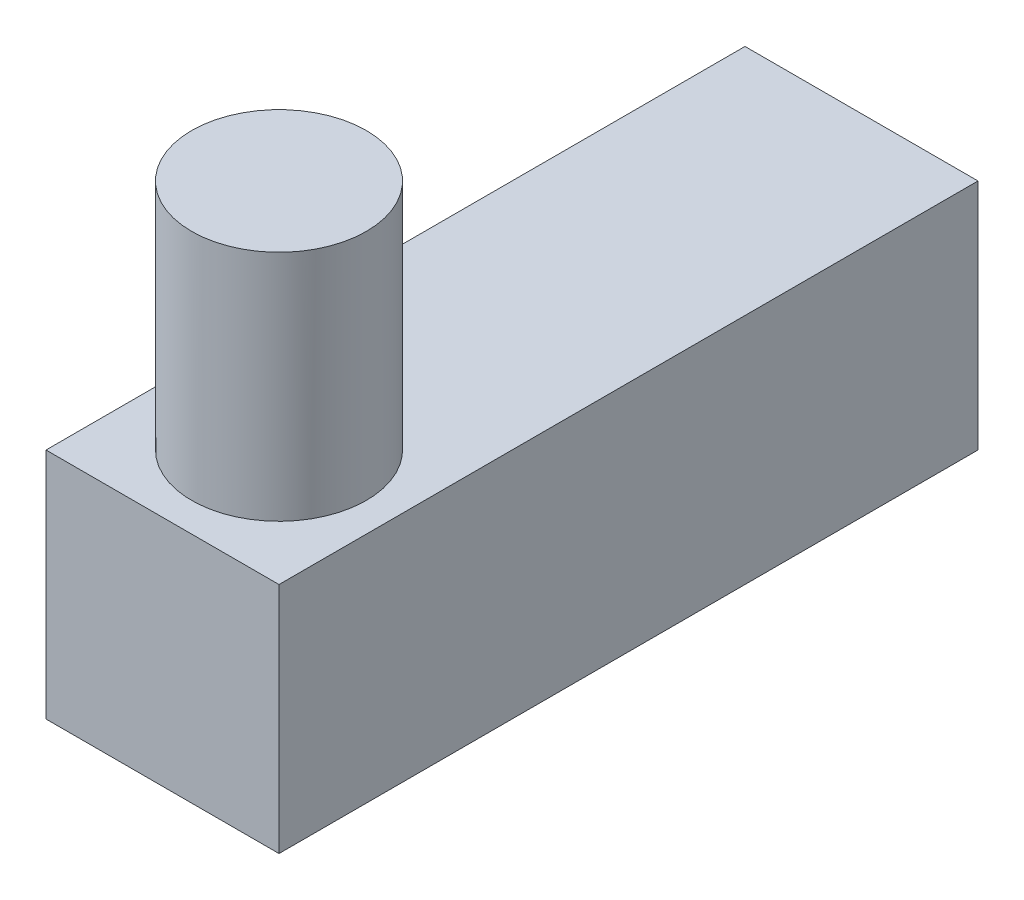
ISO-10303-21;
HEADER;
FILE_DESCRIPTION(('STEP AP214'),'2;1');
FILE_NAME('part.step','',(''),(''),'','','');
FILE_SCHEMA(('AUTOMOTIVE_DESIGN { 1 0 10303 214 1 1 1 1 }'));
ENDSEC;
DATA;
#1=APPLICATION_CONTEXT('core data for automotive mechanical design processes');
#2=APPLICATION_PROTOCOL_DEFINITION('international standard','automotive_design',2000,#1);
#3=PRODUCT_CONTEXT('',#1,'mechanical');
#4=PRODUCT('Part','Part','',(#3));
#5=PRODUCT_RELATED_PRODUCT_CATEGORY('part','',(#4));
#6=PRODUCT_DEFINITION_FORMATION('','',#4);
#7=PRODUCT_DEFINITION_CONTEXT('part definition',#1,'design');
#8=PRODUCT_DEFINITION('design','',#6,#7);
#9=PRODUCT_DEFINITION_SHAPE('','',#8);
#10=(LENGTH_UNIT() NAMED_UNIT(*) SI_UNIT(.MILLI.,.METRE.));
#11=(NAMED_UNIT(*) PLANE_ANGLE_UNIT() SI_UNIT($,.RADIAN.));
#12=(NAMED_UNIT(*) SI_UNIT($,.STERADIAN.) SOLID_ANGLE_UNIT());
#13=UNCERTAINTY_MEASURE_WITH_UNIT(LENGTH_MEASURE(1.E-05),#10,'distance_accuracy_value','');
#14=(GEOMETRIC_REPRESENTATION_CONTEXT(3) GLOBAL_UNCERTAINTY_ASSIGNED_CONTEXT((#13)) GLOBAL_UNIT_ASSIGNED_CONTEXT((#10,
#11,#12)) REPRESENTATION_CONTEXT('',''));
#15=CARTESIAN_POINT('',(0.,0.,0.));
#16=DIRECTION('',(0.,0.,1.));
#17=DIRECTION('',(1.,0.,0.));
#18=AXIS2_PLACEMENT_3D('',#15,#16,#17);
#19=CARTESIAN_POINT('',(0.,101.6,0.));
#20=DIRECTION('',(1.,0.,0.));
#21=DIRECTION('',(0.,0.,-1.));
#22=AXIS2_PLACEMENT_3D('',#19,#20,#21);
#23=PLANE('',#22);
#24=DIRECTION('',(0.,0.,1.));
#25=VECTOR('',#24,1.);
#26=CARTESIAN_POINT('',(0.,0.,0.));
#27=LINE('',#26,#25);
#28=CARTESIAN_POINT('',(0.,0.,-304.8));
#29=VERTEX_POINT('',#28);
#30=CARTESIAN_POINT('',(0.,0.,0.));
#31=VERTEX_POINT('',#30);
#32=EDGE_CURVE('E99',#29,#31,#27,.T.);
#33=ORIENTED_EDGE('',*,*,#32,.T.);
#34=DIRECTION('',(0.,-1.,0.));
#35=VECTOR('',#34,1.);
#36=CARTESIAN_POINT('',(0.,101.6,0.));
#37=LINE('',#36,#35);
#38=CARTESIAN_POINT('',(0.,101.6,0.));
#39=VERTEX_POINT('',#38);
#40=EDGE_CURVE('E41',#39,#31,#37,.T.);
#41=ORIENTED_EDGE('',*,*,#40,.F.);
#42=DIRECTION('',(0.,0.,1.));
#43=VECTOR('',#42,1.);
#44=CARTESIAN_POINT('',(0.,101.6,0.));
#45=LINE('',#44,#43);
#46=CARTESIAN_POINT('',(0.,101.6,-304.8));
#47=VERTEX_POINT('',#46);
#48=EDGE_CURVE('E85',#47,#39,#45,.T.);
#49=ORIENTED_EDGE('',*,*,#48,.F.);
#50=DIRECTION('',(0.,-1.,0.));
#51=VECTOR('',#50,1.);
#52=CARTESIAN_POINT('',(0.,101.6,-304.8));
#53=LINE('',#52,#51);
#54=EDGE_CURVE('E95',#47,#29,#53,.T.);
#55=ORIENTED_EDGE('',*,*,#54,.T.);
#56=EDGE_LOOP('',(#33,#41,#49,#55));
#57=FACE_BOUND('',#56,.T.);
#58=ADVANCED_FACE('F33',(#57),#23,.F.);
#59=CARTESIAN_POINT('',(0.,101.6,0.));
#60=DIRECTION('',(0.,0.,-1.));
#61=DIRECTION('',(-1.,0.,0.));
#62=AXIS2_PLACEMENT_3D('',#59,#60,#61);
#63=PLANE('',#62);
#64=DIRECTION('',(1.,0.,0.));
#65=VECTOR('',#64,1.);
#66=CARTESIAN_POINT('',(0.,0.,0.));
#67=LINE('',#66,#65);
#68=CARTESIAN_POINT('',(101.6,0.,0.));
#69=VERTEX_POINT('',#68);
#70=EDGE_CURVE('E90',#31,#69,#67,.T.);
#71=ORIENTED_EDGE('',*,*,#70,.T.);
#72=DIRECTION('',(0.,-1.,0.));
#73=VECTOR('',#72,1.);
#74=CARTESIAN_POINT('',(101.6,101.6,0.));
#75=LINE('',#74,#73);
#76=CARTESIAN_POINT('',(101.6,101.6,0.));
#77=VERTEX_POINT('',#76);
#78=EDGE_CURVE('E88',#77,#69,#75,.T.);
#79=ORIENTED_EDGE('',*,*,#78,.F.);
#80=DIRECTION('',(1.,0.,0.));
#81=VECTOR('',#80,1.);
#82=CARTESIAN_POINT('',(0.,101.6,0.));
#83=LINE('',#82,#81);
#84=EDGE_CURVE('E80',#39,#77,#83,.T.);
#85=ORIENTED_EDGE('',*,*,#84,.F.);
#86=ORIENTED_EDGE('',*,*,#40,.T.);
#87=EDGE_LOOP('',(#71,#79,#85,#86));
#88=FACE_BOUND('',#87,.T.);
#89=ADVANCED_FACE('F89',(#88),#63,.F.);
#90=CARTESIAN_POINT('',(101.6,101.6,0.));
#91=DIRECTION('',(-1.,0.,0.));
#92=DIRECTION('',(0.,0.,1.));
#93=AXIS2_PLACEMENT_3D('',#90,#91,#92);
#94=PLANE('',#93);
#95=DIRECTION('',(0.,0.,-1.));
#96=VECTOR('',#95,1.);
#97=CARTESIAN_POINT('',(101.6,0.,0.));
#98=LINE('',#97,#96);
#99=CARTESIAN_POINT('',(101.6,0.,-304.8));
#100=VERTEX_POINT('',#99);
#101=EDGE_CURVE('E66',#69,#100,#98,.T.);
#102=ORIENTED_EDGE('',*,*,#101,.T.);
#103=DIRECTION('',(0.,-1.,0.));
#104=VECTOR('',#103,1.);
#105=CARTESIAN_POINT('',(101.6,101.6,-304.8));
#106=LINE('',#105,#104);
#107=CARTESIAN_POINT('',(101.6,101.6,-304.8));
#108=VERTEX_POINT('',#107);
#109=EDGE_CURVE('E91',#108,#100,#106,.T.);
#110=ORIENTED_EDGE('',*,*,#109,.F.);
#111=DIRECTION('',(0.,0.,-1.));
#112=VECTOR('',#111,1.);
#113=CARTESIAN_POINT('',(101.6,101.6,0.));
#114=LINE('',#113,#112);
#115=EDGE_CURVE('E83',#77,#108,#114,.T.);
#116=ORIENTED_EDGE('',*,*,#115,.F.);
#117=ORIENTED_EDGE('',*,*,#78,.T.);
#118=EDGE_LOOP('',(#102,#110,#116,#117));
#119=FACE_BOUND('',#118,.T.);
#120=ADVANCED_FACE('F93',(#119),#94,.F.);
#121=CARTESIAN_POINT('',(0.,101.6,-304.8));
#122=DIRECTION('',(0.,0.,1.));
#123=DIRECTION('',(1.,0.,0.));
#124=AXIS2_PLACEMENT_3D('',#121,#122,#123);
#125=PLANE('',#124);
#126=DIRECTION('',(-1.,0.,0.));
#127=VECTOR('',#126,1.);
#128=CARTESIAN_POINT('',(0.,0.,-304.8));
#129=LINE('',#128,#127);
#130=EDGE_CURVE('E72',#100,#29,#129,.T.);
#131=ORIENTED_EDGE('',*,*,#130,.T.);
#132=ORIENTED_EDGE('',*,*,#54,.F.);
#133=DIRECTION('',(-1.,0.,0.));
#134=VECTOR('',#133,1.);
#135=CARTESIAN_POINT('',(0.,101.6,-304.8));
#136=LINE('',#135,#134);
#137=EDGE_CURVE('E49',#108,#47,#136,.T.);
#138=ORIENTED_EDGE('',*,*,#137,.F.);
#139=ORIENTED_EDGE('',*,*,#109,.T.);
#140=EDGE_LOOP('',(#131,#132,#138,#139));
#141=FACE_BOUND('',#140,.T.);
#142=ADVANCED_FACE('F121',(#141),#125,.F.);
#143=CARTESIAN_POINT('',(0.,101.6,0.));
#144=DIRECTION('',(0.,-1.,0.));
#145=DIRECTION('',(0.,0.,-1.));
#146=AXIS2_PLACEMENT_3D('',#143,#144,#145);
#147=PLANE('',#146);
#148=CARTESIAN_POINT('',(50.8,101.6,-50.8));
#149=DIRECTION('',(0.,-1.,0.));
#150=DIRECTION('',(0.,0.,-1.));
#151=AXIS2_PLACEMENT_3D('',#148,#149,#150);
#152=CIRCLE('',#151,38.1);
#153=CARTESIAN_POINT('',(50.8,101.6,-88.9));
#154=VERTEX_POINT('',#153);
#155=EDGE_CURVE('E11',#154,#154,#152,.F.);
#156=ORIENTED_EDGE('',*,*,#155,.F.);
#157=EDGE_LOOP('',(#156));
#158=FACE_BOUND('',#157,.T.);
#159=ORIENTED_EDGE('',*,*,#48,.T.);
#160=ORIENTED_EDGE('',*,*,#84,.T.);
#161=ORIENTED_EDGE('',*,*,#115,.T.);
#162=ORIENTED_EDGE('',*,*,#137,.T.);
#163=EDGE_LOOP('',(#159,#160,#161,#162));
#164=FACE_BOUND('',#163,.T.);
#165=ADVANCED_FACE('F81',(#158,#164),#147,.F.);
#166=CARTESIAN_POINT('',(0.,0.,0.));
#167=DIRECTION('',(0.,-1.,0.));
#168=DIRECTION('',(0.,0.,-1.));
#169=AXIS2_PLACEMENT_3D('',#166,#167,#168);
#170=PLANE('',#169);
#171=ORIENTED_EDGE('',*,*,#32,.F.);
#172=ORIENTED_EDGE('',*,*,#130,.F.);
#173=ORIENTED_EDGE('',*,*,#101,.F.);
#174=ORIENTED_EDGE('',*,*,#70,.F.);
#175=EDGE_LOOP('',(#171,#172,#173,#174));
#176=FACE_BOUND('',#175,.T.);
#177=ADVANCED_FACE('F110',(#176),#170,.T.);
#178=CARTESIAN_POINT('',(50.8,203.2,-50.8));
#179=DIRECTION('',(0.,-1.,0.));
#180=DIRECTION('',(0.,0.,-1.));
#181=AXIS2_PLACEMENT_3D('',#178,#179,#180);
#182=CYLINDRICAL_SURFACE('',#181,38.1);
#183=CARTESIAN_POINT('',(50.8,203.2,-50.8));
#184=DIRECTION('',(0.,1.,0.));
#185=DIRECTION('',(0.,0.,1.));
#186=AXIS2_PLACEMENT_3D('',#183,#184,#185);
#187=CIRCLE('',#186,38.1);
#188=CARTESIAN_POINT('',(50.8,203.2,-12.7));
#189=VERTEX_POINT('',#188);
#190=EDGE_CURVE('E102',#189,#189,#187,.T.);
#191=ORIENTED_EDGE('',*,*,#190,.F.);
#192=EDGE_LOOP('',(#191));
#193=FACE_BOUND('',#192,.T.);
#194=ORIENTED_EDGE('',*,*,#155,.T.);
#195=EDGE_LOOP('',(#194));
#196=FACE_BOUND('',#195,.T.);
#197=ADVANCED_FACE('F112',(#193,#196),#182,.T.);
#198=CARTESIAN_POINT('',(50.8,203.2,-50.8));
#199=DIRECTION('',(0.,1.,0.));
#200=DIRECTION('',(0.,0.,1.));
#201=AXIS2_PLACEMENT_3D('',#198,#199,#200);
#202=PLANE('',#201);
#203=ORIENTED_EDGE('',*,*,#190,.T.);
#204=EDGE_LOOP('',(#203));
#205=FACE_BOUND('',#204,.T.);
#206=ADVANCED_FACE('F118',(#205),#202,.T.);
#207=CLOSED_SHELL('',(#58,#89,#120,#142,#165,#177,#197,#206));
#208=MANIFOLD_SOLID_BREP('B2',#207);
#209=ADVANCED_BREP_SHAPE_REPRESENTATION('',(#18,#208),#14);
#210=SHAPE_DEFINITION_REPRESENTATION(#9,#209);
ENDSEC;
END-ISO-10303-21;
